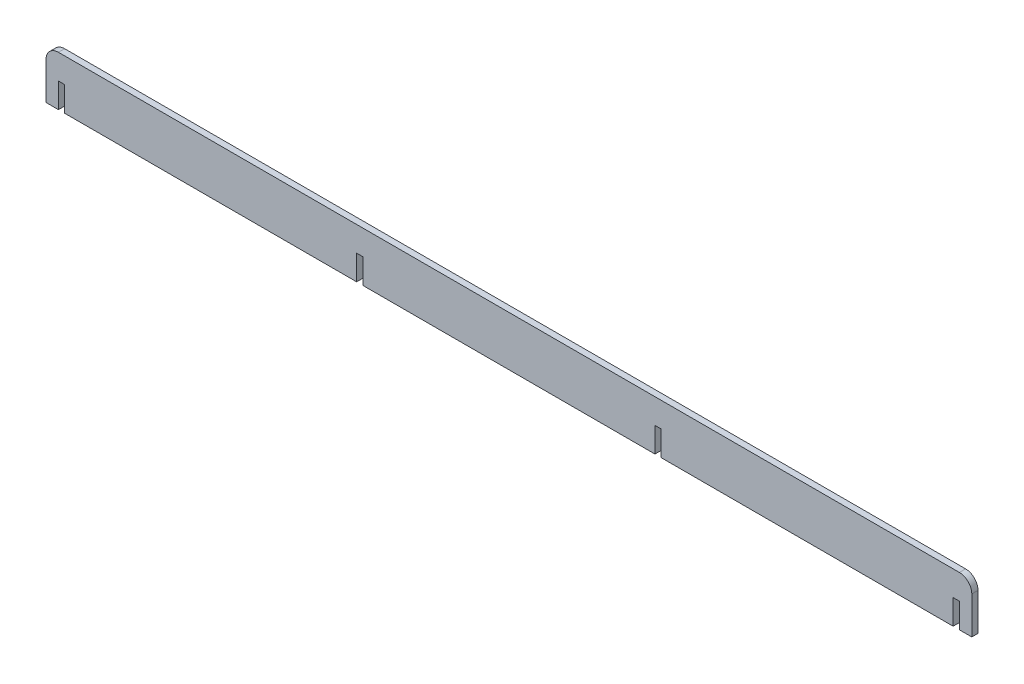
ISO-10303-21;
HEADER;
FILE_DESCRIPTION(('STEP AP214'),'2;1');
FILE_NAME('part.step','',(''),(''),'','','');
FILE_SCHEMA(('AUTOMOTIVE_DESIGN { 1 0 10303 214 1 1 1 1 }'));
ENDSEC;
DATA;
#1=APPLICATION_CONTEXT('core data for automotive mechanical design processes');
#2=APPLICATION_PROTOCOL_DEFINITION('international standard','automotive_design',2000,#1);
#3=PRODUCT_CONTEXT('',#1,'mechanical');
#4=PRODUCT('Part','Part','',(#3));
#5=PRODUCT_RELATED_PRODUCT_CATEGORY('part','',(#4));
#6=PRODUCT_DEFINITION_FORMATION('','',#4);
#7=PRODUCT_DEFINITION_CONTEXT('part definition',#1,'design');
#8=PRODUCT_DEFINITION('design','',#6,#7);
#9=PRODUCT_DEFINITION_SHAPE('','',#8);
#10=(LENGTH_UNIT() NAMED_UNIT(*) SI_UNIT(.MILLI.,.METRE.));
#11=(NAMED_UNIT(*) PLANE_ANGLE_UNIT() SI_UNIT($,.RADIAN.));
#12=(NAMED_UNIT(*) SI_UNIT($,.STERADIAN.) SOLID_ANGLE_UNIT());
#13=UNCERTAINTY_MEASURE_WITH_UNIT(LENGTH_MEASURE(1.E-05),#10,'distance_accuracy_value','');
#14=(GEOMETRIC_REPRESENTATION_CONTEXT(3) GLOBAL_UNCERTAINTY_ASSIGNED_CONTEXT((#13)) GLOBAL_UNIT_ASSIGNED_CONTEXT((#10,
#11,#12)) REPRESENTATION_CONTEXT('',''));
#15=CARTESIAN_POINT('',(0.,0.,0.));
#16=DIRECTION('',(0.,0.,1.));
#17=DIRECTION('',(1.,0.,0.));
#18=AXIS2_PLACEMENT_3D('',#15,#16,#17);
#19=CARTESIAN_POINT('',(0.,-245.446883650577,5.));
#20=DIRECTION('',(0.,1.,0.));
#21=DIRECTION('',(0.,0.,1.));
#22=AXIS2_PLACEMENT_3D('',#19,#20,#21);
#23=PLANE('',#22);
#24=DIRECTION('',(1.,0.,0.));
#25=VECTOR('',#24,1.);
#26=CARTESIAN_POINT('',(0.,-245.446883650577,0.));
#27=LINE('',#26,#25);
#28=CARTESIAN_POINT('',(-2.5,-245.446883650577,0.));
#29=VERTEX_POINT('',#28);
#30=CARTESIAN_POINT('',(2.5,-245.446883650577,0.));
#31=VERTEX_POINT('',#30);
#32=EDGE_CURVE('E211',#29,#31,#27,.T.);
#33=ORIENTED_EDGE('',*,*,#32,.T.);
#34=DIRECTION('',(0.,0.,-1.));
#35=VECTOR('',#34,1.);
#36=CARTESIAN_POINT('',(2.5,-245.446883650577,5.));
#37=LINE('',#36,#35);
#38=CARTESIAN_POINT('',(2.5,-245.446883650577,5.));
#39=VERTEX_POINT('',#38);
#40=EDGE_CURVE('E192',#39,#31,#37,.T.);
#41=ORIENTED_EDGE('',*,*,#40,.F.);
#42=DIRECTION('',(1.,0.,0.));
#43=VECTOR('',#42,1.);
#44=CARTESIAN_POINT('',(0.,-245.446883650577,5.));
#45=LINE('',#44,#43);
#46=CARTESIAN_POINT('',(-2.5,-245.446883650577,5.));
#47=VERTEX_POINT('',#46);
#48=EDGE_CURVE('E199',#47,#39,#45,.T.);
#49=ORIENTED_EDGE('',*,*,#48,.F.);
#50=DIRECTION('',(0.,0.,-1.));
#51=VECTOR('',#50,1.);
#52=CARTESIAN_POINT('',(-2.5,-245.446883650577,5.));
#53=LINE('',#52,#51);
#54=EDGE_CURVE('E288',#47,#29,#53,.T.);
#55=ORIENTED_EDGE('',*,*,#54,.T.);
#56=EDGE_LOOP('',(#33,#41,#49,#55));
#57=FACE_BOUND('',#56,.T.);
#58=ADVANCED_FACE('F37',(#57),#23,.F.);
#59=CARTESIAN_POINT('',(2.5,0.,5.));
#60=DIRECTION('',(1.,0.,0.));
#61=DIRECTION('',(0.,0.,-1.));
#62=AXIS2_PLACEMENT_3D('',#59,#60,#61);
#63=PLANE('',#62);
#64=DIRECTION('',(0.,-1.,0.));
#65=VECTOR('',#64,1.);
#66=CARTESIAN_POINT('',(2.5,0.,0.));
#67=LINE('',#66,#65);
#68=CARTESIAN_POINT('',(2.5,-265.446883650577,0.));
#69=VERTEX_POINT('',#68);
#70=EDGE_CURVE('E324',#31,#69,#67,.T.);
#71=ORIENTED_EDGE('',*,*,#70,.T.);
#72=DIRECTION('',(0.,0.,-1.));
#73=VECTOR('',#72,1.);
#74=CARTESIAN_POINT('',(2.5,-265.446883650577,5.));
#75=LINE('',#74,#73);
#76=CARTESIAN_POINT('',(2.5,-265.446883650577,5.));
#77=VERTEX_POINT('',#76);
#78=EDGE_CURVE('E195',#77,#69,#75,.T.);
#79=ORIENTED_EDGE('',*,*,#78,.F.);
#80=DIRECTION('',(0.,-1.,0.));
#81=VECTOR('',#80,1.);
#82=CARTESIAN_POINT('',(2.5,0.,5.));
#83=LINE('',#82,#81);
#84=EDGE_CURVE('E188',#39,#77,#83,.T.);
#85=ORIENTED_EDGE('',*,*,#84,.F.);
#86=ORIENTED_EDGE('',*,*,#40,.T.);
#87=EDGE_LOOP('',(#71,#79,#85,#86));
#88=FACE_BOUND('',#87,.T.);
#89=ADVANCED_FACE('F190',(#88),#63,.F.);
#90=CARTESIAN_POINT('',(0.,-265.446883650577,5.));
#91=DIRECTION('',(0.,1.,0.));
#92=DIRECTION('',(0.,0.,1.));
#93=AXIS2_PLACEMENT_3D('',#90,#91,#92);
#94=PLANE('',#93);
#95=DIRECTION('',(1.,0.,0.));
#96=VECTOR('',#95,1.);
#97=CARTESIAN_POINT('',(0.,-265.446883650577,0.));
#98=LINE('',#97,#96);
#99=CARTESIAN_POINT('',(12.5,-265.446883650577,0.));
#100=VERTEX_POINT('',#99);
#101=EDGE_CURVE('E320',#69,#100,#98,.T.);
#102=ORIENTED_EDGE('',*,*,#101,.T.);
#103=DIRECTION('',(0.,0.,-1.));
#104=VECTOR('',#103,1.);
#105=CARTESIAN_POINT('',(12.5,-265.446883650577,5.));
#106=LINE('',#105,#104);
#107=CARTESIAN_POINT('',(12.5,-265.446883650577,5.));
#108=VERTEX_POINT('',#107);
#109=EDGE_CURVE('E216',#108,#100,#106,.T.);
#110=ORIENTED_EDGE('',*,*,#109,.F.);
#111=DIRECTION('',(1.,0.,0.));
#112=VECTOR('',#111,1.);
#113=CARTESIAN_POINT('',(0.,-265.446883650577,5.));
#114=LINE('',#113,#112);
#115=EDGE_CURVE('E198',#77,#108,#114,.T.);
#116=ORIENTED_EDGE('',*,*,#115,.F.);
#117=ORIENTED_EDGE('',*,*,#78,.T.);
#118=EDGE_LOOP('',(#102,#110,#116,#117));
#119=FACE_BOUND('',#118,.T.);
#120=ADVANCED_FACE('F420',(#119),#94,.F.);
#121=CARTESIAN_POINT('',(12.5,0.,5.));
#122=DIRECTION('',(1.,0.,0.));
#123=DIRECTION('',(0.,0.,-1.));
#124=AXIS2_PLACEMENT_3D('',#121,#122,#123);
#125=PLANE('',#124);
#126=DIRECTION('',(0.,-1.,0.));
#127=VECTOR('',#126,1.);
#128=CARTESIAN_POINT('',(12.5,0.,0.));
#129=LINE('',#128,#127);
#130=CARTESIAN_POINT('',(12.5,-235.446883650577,0.));
#131=VERTEX_POINT('',#130);
#132=EDGE_CURVE('E315',#131,#100,#129,.T.);
#133=ORIENTED_EDGE('',*,*,#132,.F.);
#134=DIRECTION('',(0.,0.,-1.));
#135=VECTOR('',#134,1.);
#136=CARTESIAN_POINT('',(12.5,-235.446883650577,5.));
#137=LINE('',#136,#135);
#138=CARTESIAN_POINT('',(12.5,-235.446883650577,5.));
#139=VERTEX_POINT('',#138);
#140=EDGE_CURVE('E60',#131,#139,#137,.F.);
#141=ORIENTED_EDGE('',*,*,#140,.T.);
#142=DIRECTION('',(0.,-1.,0.));
#143=VECTOR('',#142,1.);
#144=CARTESIAN_POINT('',(12.5,0.,5.));
#145=LINE('',#144,#143);
#146=EDGE_CURVE('E294',#139,#108,#145,.T.);
#147=ORIENTED_EDGE('',*,*,#146,.T.);
#148=ORIENTED_EDGE('',*,*,#109,.T.);
#149=EDGE_LOOP('',(#133,#141,#147,#148));
#150=FACE_BOUND('',#149,.T.);
#151=ADVANCED_FACE('F317',(#150),#125,.T.);
#152=CARTESIAN_POINT('',(0.,-225.446883650577,5.));
#153=DIRECTION('',(0.,1.,0.));
#154=DIRECTION('',(0.,0.,1.));
#155=AXIS2_PLACEMENT_3D('',#152,#153,#154);
#156=PLANE('',#155);
#157=DIRECTION('',(1.,0.,0.));
#158=VECTOR('',#157,1.);
#159=CARTESIAN_POINT('',(0.,-225.446883650577,5.));
#160=LINE('',#159,#158);
#161=CARTESIAN_POINT('',(-722.5,-225.446883650577,5.));
#162=VERTEX_POINT('',#161);
#163=CARTESIAN_POINT('',(2.5,-225.446883650577,5.));
#164=VERTEX_POINT('',#163);
#165=EDGE_CURVE('E241',#162,#164,#160,.T.);
#166=ORIENTED_EDGE('',*,*,#165,.T.);
#167=DIRECTION('',(0.,0.,-1.));
#168=VECTOR('',#167,1.);
#169=CARTESIAN_POINT('',(2.5,-225.446883650577,5.));
#170=LINE('',#169,#168);
#171=CARTESIAN_POINT('',(2.5,-225.446883650577,0.));
#172=VERTEX_POINT('',#171);
#173=EDGE_CURVE('E214',#164,#172,#170,.T.);
#174=ORIENTED_EDGE('',*,*,#173,.T.);
#175=DIRECTION('',(1.,0.,0.));
#176=VECTOR('',#175,1.);
#177=CARTESIAN_POINT('',(0.,-225.446883650577,0.));
#178=LINE('',#177,#176);
#179=CARTESIAN_POINT('',(-722.5,-225.446883650577,0.));
#180=VERTEX_POINT('',#179);
#181=EDGE_CURVE('E316',#180,#172,#178,.T.);
#182=ORIENTED_EDGE('',*,*,#181,.F.);
#183=DIRECTION('',(0.,0.,-1.));
#184=VECTOR('',#183,1.);
#185=CARTESIAN_POINT('',(-722.5,-225.446883650577,5.));
#186=LINE('',#185,#184);
#187=EDGE_CURVE('E212',#180,#162,#186,.F.);
#188=ORIENTED_EDGE('',*,*,#187,.T.);
#189=EDGE_LOOP('',(#166,#174,#182,#188));
#190=FACE_BOUND('',#189,.T.);
#191=ADVANCED_FACE('F305',(#190),#156,.T.);
#192=CARTESIAN_POINT('',(-732.5,0.,5.));
#193=DIRECTION('',(1.,0.,0.));
#194=DIRECTION('',(0.,0.,-1.));
#195=AXIS2_PLACEMENT_3D('',#192,#193,#194);
#196=PLANE('',#195);
#197=DIRECTION('',(0.,-1.,0.));
#198=VECTOR('',#197,1.);
#199=CARTESIAN_POINT('',(-732.5,0.,5.));
#200=LINE('',#199,#198);
#201=CARTESIAN_POINT('',(-732.5,-235.446883650577,5.));
#202=VERTEX_POINT('',#201);
#203=CARTESIAN_POINT('',(-732.5,-265.446883650577,5.));
#204=VERTEX_POINT('',#203);
#205=EDGE_CURVE('E237',#202,#204,#200,.T.);
#206=ORIENTED_EDGE('',*,*,#205,.F.);
#207=DIRECTION('',(0.,0.,-1.));
#208=VECTOR('',#207,1.);
#209=CARTESIAN_POINT('',(-732.5,-235.446883650577,0.));
#210=LINE('',#209,#208);
#211=CARTESIAN_POINT('',(-732.5,-235.446883650577,0.));
#212=VERTEX_POINT('',#211);
#213=EDGE_CURVE('E12',#202,#212,#210,.T.);
#214=ORIENTED_EDGE('',*,*,#213,.T.);
#215=DIRECTION('',(0.,-1.,0.));
#216=VECTOR('',#215,1.);
#217=CARTESIAN_POINT('',(-732.5,0.,0.));
#218=LINE('',#217,#216);
#219=CARTESIAN_POINT('',(-732.5,-265.446883650577,0.));
#220=VERTEX_POINT('',#219);
#221=EDGE_CURVE('E322',#212,#220,#218,.T.);
#222=ORIENTED_EDGE('',*,*,#221,.T.);
#223=DIRECTION('',(0.,0.,-1.));
#224=VECTOR('',#223,1.);
#225=CARTESIAN_POINT('',(-732.5,-265.446883650577,5.));
#226=LINE('',#225,#224);
#227=EDGE_CURVE('E391',#204,#220,#226,.T.);
#228=ORIENTED_EDGE('',*,*,#227,.F.);
#229=EDGE_LOOP('',(#206,#214,#222,#228));
#230=FACE_BOUND('',#229,.T.);
#231=ADVANCED_FACE('F433',(#230),#196,.F.);
#232=CARTESIAN_POINT('',(-722.5,-265.446883650577,0.));
#233=VERTEX_POINT('',#232);
#234=EDGE_CURVE('E327',#220,#233,#98,.T.);
#235=ORIENTED_EDGE('',*,*,#234,.T.);
#236=DIRECTION('',(0.,0.,-1.));
#237=VECTOR('',#236,1.);
#238=CARTESIAN_POINT('',(-722.5,-265.446883650577,5.));
#239=LINE('',#238,#237);
#240=CARTESIAN_POINT('',(-722.5,-265.446883650577,5.));
#241=VERTEX_POINT('',#240);
#242=EDGE_CURVE('E388',#241,#233,#239,.T.);
#243=ORIENTED_EDGE('',*,*,#242,.F.);
#244=EDGE_CURVE('E240',#204,#241,#114,.T.);
#245=ORIENTED_EDGE('',*,*,#244,.F.);
#246=ORIENTED_EDGE('',*,*,#227,.T.);
#247=EDGE_LOOP('',(#235,#243,#245,#246));
#248=FACE_BOUND('',#247,.T.);
#249=ADVANCED_FACE('F397',(#248),#94,.F.);
#250=CARTESIAN_POINT('',(-722.5,0.,5.));
#251=DIRECTION('',(-1.,0.,0.));
#252=DIRECTION('',(0.,0.,1.));
#253=AXIS2_PLACEMENT_3D('',#250,#251,#252);
#254=PLANE('',#253);
#255=DIRECTION('',(0.,1.,0.));
#256=VECTOR('',#255,1.);
#257=CARTESIAN_POINT('',(-722.5,0.,0.));
#258=LINE('',#257,#256);
#259=CARTESIAN_POINT('',(-722.5,-245.446883650577,0.));
#260=VERTEX_POINT('',#259);
#261=EDGE_CURVE('E330',#233,#260,#258,.T.);
#262=ORIENTED_EDGE('',*,*,#261,.T.);
#263=DIRECTION('',(0.,0.,-1.));
#264=VECTOR('',#263,1.);
#265=CARTESIAN_POINT('',(-722.5,-245.446883650577,5.));
#266=LINE('',#265,#264);
#267=CARTESIAN_POINT('',(-722.5,-245.446883650577,5.));
#268=VERTEX_POINT('',#267);
#269=EDGE_CURVE('E385',#268,#260,#266,.T.);
#270=ORIENTED_EDGE('',*,*,#269,.F.);
#271=DIRECTION('',(0.,1.,0.));
#272=VECTOR('',#271,1.);
#273=CARTESIAN_POINT('',(-722.5,0.,5.));
#274=LINE('',#273,#272);
#275=EDGE_CURVE('E244',#241,#268,#274,.T.);
#276=ORIENTED_EDGE('',*,*,#275,.F.);
#277=ORIENTED_EDGE('',*,*,#242,.T.);
#278=EDGE_LOOP('',(#262,#270,#276,#277));
#279=FACE_BOUND('',#278,.T.);
#280=ADVANCED_FACE('F432',(#279),#254,.F.);
#281=CARTESIAN_POINT('',(0.,-245.446883650577,5.));
#282=DIRECTION('',(0.,1.,0.));
#283=DIRECTION('',(0.,0.,1.));
#284=AXIS2_PLACEMENT_3D('',#281,#282,#283);
#285=PLANE('',#284);
#286=DIRECTION('',(1.,0.,0.));
#287=VECTOR('',#286,1.);
#288=CARTESIAN_POINT('',(0.,-245.446883650577,0.));
#289=LINE('',#288,#287);
#290=CARTESIAN_POINT('',(-717.5,-245.446883650577,0.));
#291=VERTEX_POINT('',#290);
#292=EDGE_CURVE('E332',#260,#291,#289,.T.);
#293=ORIENTED_EDGE('',*,*,#292,.T.);
#294=DIRECTION('',(0.,0.,-1.));
#295=VECTOR('',#294,1.);
#296=CARTESIAN_POINT('',(-717.5,-245.446883650577,5.));
#297=LINE('',#296,#295);
#298=CARTESIAN_POINT('',(-717.5,-245.446883650577,5.));
#299=VERTEX_POINT('',#298);
#300=EDGE_CURVE('E382',#299,#291,#297,.T.);
#301=ORIENTED_EDGE('',*,*,#300,.F.);
#302=DIRECTION('',(1.,0.,0.));
#303=VECTOR('',#302,1.);
#304=CARTESIAN_POINT('',(0.,-245.446883650577,5.));
#305=LINE('',#304,#303);
#306=EDGE_CURVE('E247',#268,#299,#305,.T.);
#307=ORIENTED_EDGE('',*,*,#306,.F.);
#308=ORIENTED_EDGE('',*,*,#269,.T.);
#309=EDGE_LOOP('',(#293,#301,#307,#308));
#310=FACE_BOUND('',#309,.T.);
#311=ADVANCED_FACE('F528',(#310),#285,.F.);
#312=CARTESIAN_POINT('',(-717.5,0.,5.));
#313=DIRECTION('',(1.,0.,0.));
#314=DIRECTION('',(0.,0.,-1.));
#315=AXIS2_PLACEMENT_3D('',#312,#313,#314);
#316=PLANE('',#315);
#317=DIRECTION('',(0.,-1.,0.));
#318=VECTOR('',#317,1.);
#319=CARTESIAN_POINT('',(-717.5,0.,0.));
#320=LINE('',#319,#318);
#321=CARTESIAN_POINT('',(-717.5,-265.446883650577,0.));
#322=VERTEX_POINT('',#321);
#323=EDGE_CURVE('E334',#291,#322,#320,.T.);
#324=ORIENTED_EDGE('',*,*,#323,.T.);
#325=DIRECTION('',(0.,0.,-1.));
#326=VECTOR('',#325,1.);
#327=CARTESIAN_POINT('',(-717.5,-265.446883650577,5.));
#328=LINE('',#327,#326);
#329=CARTESIAN_POINT('',(-717.5,-265.446883650577,5.));
#330=VERTEX_POINT('',#329);
#331=EDGE_CURVE('E379',#330,#322,#328,.T.);
#332=ORIENTED_EDGE('',*,*,#331,.F.);
#333=DIRECTION('',(0.,-1.,0.));
#334=VECTOR('',#333,1.);
#335=CARTESIAN_POINT('',(-717.5,0.,5.));
#336=LINE('',#335,#334);
#337=EDGE_CURVE('E254',#299,#330,#336,.T.);
#338=ORIENTED_EDGE('',*,*,#337,.F.);
#339=ORIENTED_EDGE('',*,*,#300,.T.);
#340=EDGE_LOOP('',(#324,#332,#338,#339));
#341=FACE_BOUND('',#340,.T.);
#342=ADVANCED_FACE('F538',(#341),#316,.F.);
#343=CARTESIAN_POINT('',(-482.5,-265.446883650577,0.));
#344=VERTEX_POINT('',#343);
#345=EDGE_CURVE('E336',#322,#344,#98,.T.);
#346=ORIENTED_EDGE('',*,*,#345,.T.);
#347=DIRECTION('',(0.,0.,-1.));
#348=VECTOR('',#347,1.);
#349=CARTESIAN_POINT('',(-482.5,-265.446883650577,5.));
#350=LINE('',#349,#348);
#351=CARTESIAN_POINT('',(-482.5,-265.446883650577,5.));
#352=VERTEX_POINT('',#351);
#353=EDGE_CURVE('E376',#352,#344,#350,.T.);
#354=ORIENTED_EDGE('',*,*,#353,.F.);
#355=EDGE_CURVE('E257',#330,#352,#114,.T.);
#356=ORIENTED_EDGE('',*,*,#355,.F.);
#357=ORIENTED_EDGE('',*,*,#331,.T.);
#358=EDGE_LOOP('',(#346,#354,#356,#357));
#359=FACE_BOUND('',#358,.T.);
#360=ADVANCED_FACE('F434',(#359),#94,.F.);
#361=CARTESIAN_POINT('',(-482.5,0.,5.));
#362=DIRECTION('',(-1.,0.,0.));
#363=DIRECTION('',(0.,0.,1.));
#364=AXIS2_PLACEMENT_3D('',#361,#362,#363);
#365=PLANE('',#364);
#366=DIRECTION('',(0.,1.,0.));
#367=VECTOR('',#366,1.);
#368=CARTESIAN_POINT('',(-482.5,0.,0.));
#369=LINE('',#368,#367);
#370=CARTESIAN_POINT('',(-482.5,-245.446883650577,0.));
#371=VERTEX_POINT('',#370);
#372=EDGE_CURVE('E337',#344,#371,#369,.T.);
#373=ORIENTED_EDGE('',*,*,#372,.T.);
#374=DIRECTION('',(0.,0.,-1.));
#375=VECTOR('',#374,1.);
#376=CARTESIAN_POINT('',(-482.5,-245.446883650577,5.));
#377=LINE('',#376,#375);
#378=CARTESIAN_POINT('',(-482.5,-245.446883650577,5.));
#379=VERTEX_POINT('',#378);
#380=EDGE_CURVE('E373',#379,#371,#377,.T.);
#381=ORIENTED_EDGE('',*,*,#380,.F.);
#382=DIRECTION('',(0.,1.,0.));
#383=VECTOR('',#382,1.);
#384=CARTESIAN_POINT('',(-482.5,0.,5.));
#385=LINE('',#384,#383);
#386=EDGE_CURVE('E258',#352,#379,#385,.T.);
#387=ORIENTED_EDGE('',*,*,#386,.F.);
#388=ORIENTED_EDGE('',*,*,#353,.T.);
#389=EDGE_LOOP('',(#373,#381,#387,#388));
#390=FACE_BOUND('',#389,.T.);
#391=ADVANCED_FACE('F557',(#390),#365,.F.);
#392=CARTESIAN_POINT('',(0.,-245.446883650577,5.));
#393=DIRECTION('',(0.,1.,0.));
#394=DIRECTION('',(0.,0.,1.));
#395=AXIS2_PLACEMENT_3D('',#392,#393,#394);
#396=PLANE('',#395);
#397=DIRECTION('',(1.,0.,0.));
#398=VECTOR('',#397,1.);
#399=CARTESIAN_POINT('',(0.,-245.446883650577,0.));
#400=LINE('',#399,#398);
#401=CARTESIAN_POINT('',(-477.5,-245.446883650577,0.));
#402=VERTEX_POINT('',#401);
#403=EDGE_CURVE('E339',#371,#402,#400,.T.);
#404=ORIENTED_EDGE('',*,*,#403,.T.);
#405=DIRECTION('',(0.,0.,-1.));
#406=VECTOR('',#405,1.);
#407=CARTESIAN_POINT('',(-477.5,-245.446883650577,5.));
#408=LINE('',#407,#406);
#409=CARTESIAN_POINT('',(-477.5,-245.446883650577,5.));
#410=VERTEX_POINT('',#409);
#411=EDGE_CURVE('E370',#410,#402,#408,.T.);
#412=ORIENTED_EDGE('',*,*,#411,.F.);
#413=DIRECTION('',(1.,0.,0.));
#414=VECTOR('',#413,1.);
#415=CARTESIAN_POINT('',(0.,-245.446883650577,5.));
#416=LINE('',#415,#414);
#417=EDGE_CURVE('E261',#379,#410,#416,.T.);
#418=ORIENTED_EDGE('',*,*,#417,.F.);
#419=ORIENTED_EDGE('',*,*,#380,.T.);
#420=EDGE_LOOP('',(#404,#412,#418,#419));
#421=FACE_BOUND('',#420,.T.);
#422=ADVANCED_FACE('F565',(#421),#396,.F.);
#423=CARTESIAN_POINT('',(-477.5,0.,5.));
#424=DIRECTION('',(1.,0.,0.));
#425=DIRECTION('',(0.,0.,-1.));
#426=AXIS2_PLACEMENT_3D('',#423,#424,#425);
#427=PLANE('',#426);
#428=DIRECTION('',(0.,-1.,0.));
#429=VECTOR('',#428,1.);
#430=CARTESIAN_POINT('',(-477.5,0.,0.));
#431=LINE('',#430,#429);
#432=CARTESIAN_POINT('',(-477.5,-265.446883650577,0.));
#433=VERTEX_POINT('',#432);
#434=EDGE_CURVE('E341',#402,#433,#431,.T.);
#435=ORIENTED_EDGE('',*,*,#434,.T.);
#436=DIRECTION('',(0.,0.,-1.));
#437=VECTOR('',#436,1.);
#438=CARTESIAN_POINT('',(-477.5,-265.446883650577,5.));
#439=LINE('',#438,#437);
#440=CARTESIAN_POINT('',(-477.5,-265.446883650577,5.));
#441=VERTEX_POINT('',#440);
#442=EDGE_CURVE('E367',#441,#433,#439,.T.);
#443=ORIENTED_EDGE('',*,*,#442,.F.);
#444=DIRECTION('',(0.,-1.,0.));
#445=VECTOR('',#444,1.);
#446=CARTESIAN_POINT('',(-477.5,0.,5.));
#447=LINE('',#446,#445);
#448=EDGE_CURVE('E268',#410,#441,#447,.T.);
#449=ORIENTED_EDGE('',*,*,#448,.F.);
#450=ORIENTED_EDGE('',*,*,#411,.T.);
#451=EDGE_LOOP('',(#435,#443,#449,#450));
#452=FACE_BOUND('',#451,.T.);
#453=ADVANCED_FACE('F575',(#452),#427,.F.);
#454=CARTESIAN_POINT('',(-242.5,-265.446883650577,0.));
#455=VERTEX_POINT('',#454);
#456=EDGE_CURVE('E343',#433,#455,#98,.T.);
#457=ORIENTED_EDGE('',*,*,#456,.T.);
#458=DIRECTION('',(0.,0.,-1.));
#459=VECTOR('',#458,1.);
#460=CARTESIAN_POINT('',(-242.5,-265.446883650577,5.));
#461=LINE('',#460,#459);
#462=CARTESIAN_POINT('',(-242.5,-265.446883650577,5.));
#463=VERTEX_POINT('',#462);
#464=EDGE_CURVE('E364',#463,#455,#461,.T.);
#465=ORIENTED_EDGE('',*,*,#464,.F.);
#466=EDGE_CURVE('E271',#441,#463,#114,.T.);
#467=ORIENTED_EDGE('',*,*,#466,.F.);
#468=ORIENTED_EDGE('',*,*,#442,.T.);
#469=EDGE_LOOP('',(#457,#465,#467,#468));
#470=FACE_BOUND('',#469,.T.);
#471=ADVANCED_FACE('F437',(#470),#94,.F.);
#472=CARTESIAN_POINT('',(-242.5,0.,5.));
#473=DIRECTION('',(-1.,0.,0.));
#474=DIRECTION('',(0.,0.,1.));
#475=AXIS2_PLACEMENT_3D('',#472,#473,#474);
#476=PLANE('',#475);
#477=DIRECTION('',(0.,1.,0.));
#478=VECTOR('',#477,1.);
#479=CARTESIAN_POINT('',(-242.5,0.,0.));
#480=LINE('',#479,#478);
#481=CARTESIAN_POINT('',(-242.5,-245.446883650577,0.));
#482=VERTEX_POINT('',#481);
#483=EDGE_CURVE('E344',#455,#482,#480,.T.);
#484=ORIENTED_EDGE('',*,*,#483,.T.);
#485=DIRECTION('',(0.,0.,-1.));
#486=VECTOR('',#485,1.);
#487=CARTESIAN_POINT('',(-242.5,-245.446883650577,5.));
#488=LINE('',#487,#486);
#489=CARTESIAN_POINT('',(-242.5,-245.446883650577,5.));
#490=VERTEX_POINT('',#489);
#491=EDGE_CURVE('E361',#490,#482,#488,.T.);
#492=ORIENTED_EDGE('',*,*,#491,.F.);
#493=DIRECTION('',(0.,1.,0.));
#494=VECTOR('',#493,1.);
#495=CARTESIAN_POINT('',(-242.5,0.,5.));
#496=LINE('',#495,#494);
#497=EDGE_CURVE('E272',#463,#490,#496,.T.);
#498=ORIENTED_EDGE('',*,*,#497,.F.);
#499=ORIENTED_EDGE('',*,*,#464,.T.);
#500=EDGE_LOOP('',(#484,#492,#498,#499));
#501=FACE_BOUND('',#500,.T.);
#502=ADVANCED_FACE('F594',(#501),#476,.F.);
#503=CARTESIAN_POINT('',(0.,-245.446883650577,5.));
#504=DIRECTION('',(0.,1.,0.));
#505=DIRECTION('',(0.,0.,1.));
#506=AXIS2_PLACEMENT_3D('',#503,#504,#505);
#507=PLANE('',#506);
#508=DIRECTION('',(1.,0.,0.));
#509=VECTOR('',#508,1.);
#510=CARTESIAN_POINT('',(0.,-245.446883650577,0.));
#511=LINE('',#510,#509);
#512=CARTESIAN_POINT('',(-237.5,-245.446883650577,0.));
#513=VERTEX_POINT('',#512);
#514=EDGE_CURVE('E346',#482,#513,#511,.T.);
#515=ORIENTED_EDGE('',*,*,#514,.T.);
#516=DIRECTION('',(0.,0.,-1.));
#517=VECTOR('',#516,1.);
#518=CARTESIAN_POINT('',(-237.5,-245.446883650577,5.));
#519=LINE('',#518,#517);
#520=CARTESIAN_POINT('',(-237.5,-245.446883650577,5.));
#521=VERTEX_POINT('',#520);
#522=EDGE_CURVE('E358',#521,#513,#519,.T.);
#523=ORIENTED_EDGE('',*,*,#522,.F.);
#524=DIRECTION('',(1.,0.,0.));
#525=VECTOR('',#524,1.);
#526=CARTESIAN_POINT('',(0.,-245.446883650577,5.));
#527=LINE('',#526,#525);
#528=EDGE_CURVE('E275',#490,#521,#527,.T.);
#529=ORIENTED_EDGE('',*,*,#528,.F.);
#530=ORIENTED_EDGE('',*,*,#491,.T.);
#531=EDGE_LOOP('',(#515,#523,#529,#530));
#532=FACE_BOUND('',#531,.T.);
#533=ADVANCED_FACE('F602',(#532),#507,.F.);
#534=CARTESIAN_POINT('',(-237.5,0.,5.));
#535=DIRECTION('',(1.,0.,0.));
#536=DIRECTION('',(0.,0.,-1.));
#537=AXIS2_PLACEMENT_3D('',#534,#535,#536);
#538=PLANE('',#537);
#539=DIRECTION('',(0.,-1.,0.));
#540=VECTOR('',#539,1.);
#541=CARTESIAN_POINT('',(-237.5,0.,0.));
#542=LINE('',#541,#540);
#543=CARTESIAN_POINT('',(-237.5,-265.446883650577,0.));
#544=VERTEX_POINT('',#543);
#545=EDGE_CURVE('E348',#513,#544,#542,.T.);
#546=ORIENTED_EDGE('',*,*,#545,.T.);
#547=DIRECTION('',(0.,0.,-1.));
#548=VECTOR('',#547,1.);
#549=CARTESIAN_POINT('',(-237.5,-265.446883650577,5.));
#550=LINE('',#549,#548);
#551=CARTESIAN_POINT('',(-237.5,-265.446883650577,5.));
#552=VERTEX_POINT('',#551);
#553=EDGE_CURVE('E355',#552,#544,#550,.T.);
#554=ORIENTED_EDGE('',*,*,#553,.F.);
#555=DIRECTION('',(0.,-1.,0.));
#556=VECTOR('',#555,1.);
#557=CARTESIAN_POINT('',(-237.5,0.,5.));
#558=LINE('',#557,#556);
#559=EDGE_CURVE('E282',#521,#552,#558,.T.);
#560=ORIENTED_EDGE('',*,*,#559,.F.);
#561=ORIENTED_EDGE('',*,*,#522,.T.);
#562=EDGE_LOOP('',(#546,#554,#560,#561));
#563=FACE_BOUND('',#562,.T.);
#564=ADVANCED_FACE('F436',(#563),#538,.F.);
#565=CARTESIAN_POINT('',(-2.5,-265.446883650577,0.));
#566=VERTEX_POINT('',#565);
#567=EDGE_CURVE('E326',#544,#566,#98,.T.);
#568=ORIENTED_EDGE('',*,*,#567,.T.);
#569=DIRECTION('',(0.,0.,-1.));
#570=VECTOR('',#569,1.);
#571=CARTESIAN_POINT('',(-2.5,-265.446883650577,5.));
#572=LINE('',#571,#570);
#573=CARTESIAN_POINT('',(-2.5,-265.446883650577,5.));
#574=VERTEX_POINT('',#573);
#575=EDGE_CURVE('E352',#574,#566,#572,.T.);
#576=ORIENTED_EDGE('',*,*,#575,.F.);
#577=EDGE_CURVE('E285',#552,#574,#114,.T.);
#578=ORIENTED_EDGE('',*,*,#577,.F.);
#579=ORIENTED_EDGE('',*,*,#553,.T.);
#580=EDGE_LOOP('',(#568,#576,#578,#579));
#581=FACE_BOUND('',#580,.T.);
#582=ADVANCED_FACE('F412',(#581),#94,.F.);
#583=CARTESIAN_POINT('',(-2.5,0.,5.));
#584=DIRECTION('',(-1.,0.,0.));
#585=DIRECTION('',(0.,0.,1.));
#586=AXIS2_PLACEMENT_3D('',#583,#584,#585);
#587=PLANE('',#586);
#588=DIRECTION('',(0.,1.,0.));
#589=VECTOR('',#588,1.);
#590=CARTESIAN_POINT('',(-2.5,0.,0.));
#591=LINE('',#590,#589);
#592=EDGE_CURVE('E208',#566,#29,#591,.T.);
#593=ORIENTED_EDGE('',*,*,#592,.T.);
#594=ORIENTED_EDGE('',*,*,#54,.F.);
#595=DIRECTION('',(0.,1.,0.));
#596=VECTOR('',#595,1.);
#597=CARTESIAN_POINT('',(-2.5,0.,5.));
#598=LINE('',#597,#596);
#599=EDGE_CURVE('E204',#574,#47,#598,.T.);
#600=ORIENTED_EDGE('',*,*,#599,.F.);
#601=ORIENTED_EDGE('',*,*,#575,.T.);
#602=EDGE_LOOP('',(#593,#594,#600,#601));
#603=FACE_BOUND('',#602,.T.);
#604=ADVANCED_FACE('F418',(#603),#587,.F.);
#605=CARTESIAN_POINT('',(0.,0.,5.));
#606=DIRECTION('',(0.,0.,1.));
#607=DIRECTION('',(1.,0.,0.));
#608=AXIS2_PLACEMENT_3D('',#605,#606,#607);
#609=PLANE('',#608);
#610=ORIENTED_EDGE('',*,*,#146,.F.);
#611=CARTESIAN_POINT('',(2.5,-235.446883650577,5.));
#612=DIRECTION('',(0.,0.,1.));
#613=DIRECTION('',(1.,0.,0.));
#614=AXIS2_PLACEMENT_3D('',#611,#612,#613);
#615=CIRCLE('',#614,10.);
#616=EDGE_CURVE('E45',#139,#164,#615,.T.);
#617=ORIENTED_EDGE('',*,*,#616,.T.);
#618=ORIENTED_EDGE('',*,*,#165,.F.);
#619=CARTESIAN_POINT('',(-722.5,-235.446883650577,5.));
#620=DIRECTION('',(0.,0.,1.));
#621=DIRECTION('',(1.,0.,0.));
#622=AXIS2_PLACEMENT_3D('',#619,#620,#621);
#623=CIRCLE('',#622,10.);
#624=EDGE_CURVE('E52',#162,#202,#623,.T.);
#625=ORIENTED_EDGE('',*,*,#624,.T.);
#626=ORIENTED_EDGE('',*,*,#205,.T.);
#627=ORIENTED_EDGE('',*,*,#244,.T.);
#628=ORIENTED_EDGE('',*,*,#275,.T.);
#629=ORIENTED_EDGE('',*,*,#306,.T.);
#630=ORIENTED_EDGE('',*,*,#337,.T.);
#631=ORIENTED_EDGE('',*,*,#355,.T.);
#632=ORIENTED_EDGE('',*,*,#386,.T.);
#633=ORIENTED_EDGE('',*,*,#417,.T.);
#634=ORIENTED_EDGE('',*,*,#448,.T.);
#635=ORIENTED_EDGE('',*,*,#466,.T.);
#636=ORIENTED_EDGE('',*,*,#497,.T.);
#637=ORIENTED_EDGE('',*,*,#528,.T.);
#638=ORIENTED_EDGE('',*,*,#559,.T.);
#639=ORIENTED_EDGE('',*,*,#577,.T.);
#640=ORIENTED_EDGE('',*,*,#599,.T.);
#641=ORIENTED_EDGE('',*,*,#48,.T.);
#642=ORIENTED_EDGE('',*,*,#84,.T.);
#643=ORIENTED_EDGE('',*,*,#115,.T.);
#644=EDGE_LOOP('',(#610,#617,#618,#625,#626,#627,#628,#629,#630,#631,#632,#633,#634,#635,#636,
#637,#638,#639,#640,#641,#642,#643));
#645=FACE_BOUND('',#644,.T.);
#646=ADVANCED_FACE('F202',(#645),#609,.T.);
#647=CARTESIAN_POINT('',(0.,0.,0.));
#648=DIRECTION('',(0.,0.,1.));
#649=DIRECTION('',(1.,0.,0.));
#650=AXIS2_PLACEMENT_3D('',#647,#648,#649);
#651=PLANE('',#650);
#652=ORIENTED_EDGE('',*,*,#181,.T.);
#653=CARTESIAN_POINT('',(2.5,-235.446883650577,0.));
#654=DIRECTION('',(0.,0.,1.));
#655=DIRECTION('',(1.,0.,0.));
#656=AXIS2_PLACEMENT_3D('',#653,#654,#655);
#657=CIRCLE('',#656,10.);
#658=EDGE_CURVE('E224',#172,#131,#657,.F.);
#659=ORIENTED_EDGE('',*,*,#658,.T.);
#660=ORIENTED_EDGE('',*,*,#132,.T.);
#661=ORIENTED_EDGE('',*,*,#101,.F.);
#662=ORIENTED_EDGE('',*,*,#70,.F.);
#663=ORIENTED_EDGE('',*,*,#32,.F.);
#664=ORIENTED_EDGE('',*,*,#592,.F.);
#665=ORIENTED_EDGE('',*,*,#567,.F.);
#666=ORIENTED_EDGE('',*,*,#545,.F.);
#667=ORIENTED_EDGE('',*,*,#514,.F.);
#668=ORIENTED_EDGE('',*,*,#483,.F.);
#669=ORIENTED_EDGE('',*,*,#456,.F.);
#670=ORIENTED_EDGE('',*,*,#434,.F.);
#671=ORIENTED_EDGE('',*,*,#403,.F.);
#672=ORIENTED_EDGE('',*,*,#372,.F.);
#673=ORIENTED_EDGE('',*,*,#345,.F.);
#674=ORIENTED_EDGE('',*,*,#323,.F.);
#675=ORIENTED_EDGE('',*,*,#292,.F.);
#676=ORIENTED_EDGE('',*,*,#261,.F.);
#677=ORIENTED_EDGE('',*,*,#234,.F.);
#678=ORIENTED_EDGE('',*,*,#221,.F.);
#679=CARTESIAN_POINT('',(-722.5,-235.446883650577,0.));
#680=DIRECTION('',(0.,0.,1.));
#681=DIRECTION('',(1.,0.,0.));
#682=AXIS2_PLACEMENT_3D('',#679,#680,#681);
#683=CIRCLE('',#682,10.);
#684=EDGE_CURVE('E222',#212,#180,#683,.F.);
#685=ORIENTED_EDGE('',*,*,#684,.T.);
#686=EDGE_LOOP('',(#652,#659,#660,#661,#662,#663,#664,#665,#666,#667,#668,#669,#670,#671,#672,
#673,#674,#675,#676,#677,#678,#685));
#687=FACE_BOUND('',#686,.T.);
#688=ADVANCED_FACE('F313',(#687),#651,.F.);
#689=CARTESIAN_POINT('',(2.5,-235.446883650577,5.));
#690=DIRECTION('',(0.,0.,-1.));
#691=DIRECTION('',(-1.,0.,0.));
#692=AXIS2_PLACEMENT_3D('',#689,#690,#691);
#693=CYLINDRICAL_SURFACE('',#692,10.);
#694=ORIENTED_EDGE('',*,*,#616,.F.);
#695=ORIENTED_EDGE('',*,*,#140,.F.);
#696=ORIENTED_EDGE('',*,*,#658,.F.);
#697=ORIENTED_EDGE('',*,*,#173,.F.);
#698=EDGE_LOOP('',(#694,#695,#696,#697));
#699=FACE_BOUND('',#698,.T.);
#700=ADVANCED_FACE('F311',(#699),#693,.T.);
#701=CARTESIAN_POINT('',(-722.5,-235.446883650577,5.));
#702=DIRECTION('',(0.,0.,1.));
#703=DIRECTION('',(1.,0.,0.));
#704=AXIS2_PLACEMENT_3D('',#701,#702,#703);
#705=CYLINDRICAL_SURFACE('',#704,10.);
#706=ORIENTED_EDGE('',*,*,#624,.F.);
#707=ORIENTED_EDGE('',*,*,#187,.F.);
#708=ORIENTED_EDGE('',*,*,#684,.F.);
#709=ORIENTED_EDGE('',*,*,#213,.F.);
#710=EDGE_LOOP('',(#706,#707,#708,#709));
#711=FACE_BOUND('',#710,.T.);
#712=ADVANCED_FACE('F39',(#711),#705,.T.);
#713=CLOSED_SHELL('',(#58,#89,#120,#151,#191,#231,#249,#280,#311,#342,#360,#391,#422,#453,#471,
#502,#533,#564,#582,#604,#646,#688,#700,#712));
#714=MANIFOLD_SOLID_BREP('B2',#713);
#715=ADVANCED_BREP_SHAPE_REPRESENTATION('',(#18,#714),#14);
#716=SHAPE_DEFINITION_REPRESENTATION(#9,#715);
ENDSEC;
END-ISO-10303-21;
